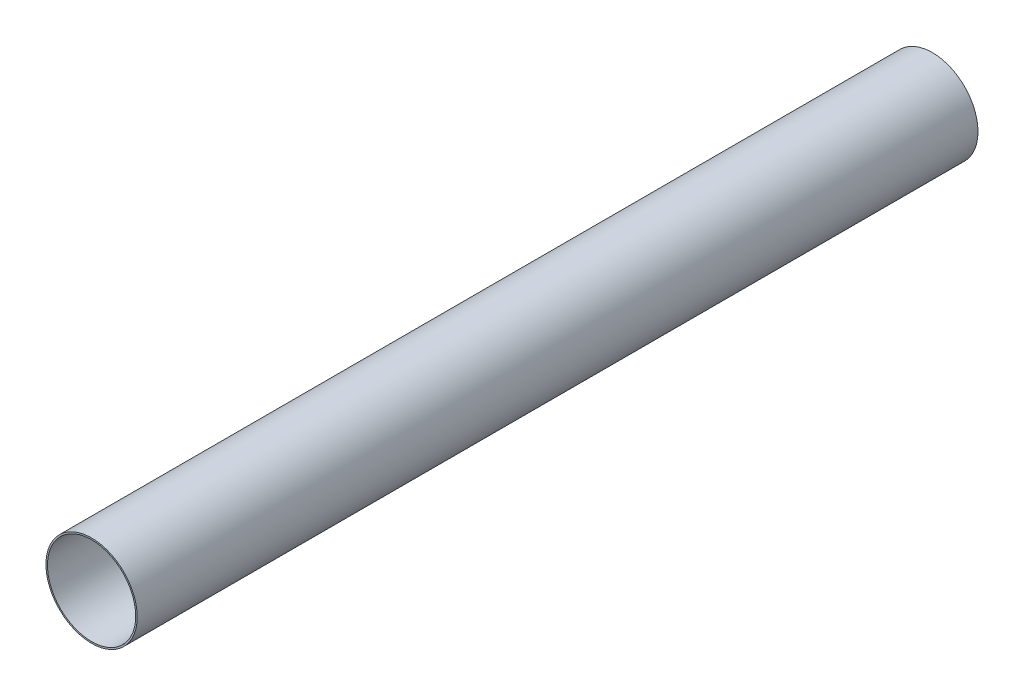
ISO-10303-21;
HEADER;
FILE_DESCRIPTION(('STEP AP214'),'2;1');
FILE_NAME('part.step','',(''),(''),'','','');
FILE_SCHEMA(('AUTOMOTIVE_DESIGN { 1 0 10303 214 1 1 1 1 }'));
ENDSEC;
DATA;
#1=APPLICATION_CONTEXT('core data for automotive mechanical design processes');
#2=APPLICATION_PROTOCOL_DEFINITION('international standard','automotive_design',2000,#1);
#3=PRODUCT_CONTEXT('',#1,'mechanical');
#4=PRODUCT('Part','Part','',(#3));
#5=PRODUCT_RELATED_PRODUCT_CATEGORY('part','',(#4));
#6=PRODUCT_DEFINITION_FORMATION('','',#4);
#7=PRODUCT_DEFINITION_CONTEXT('part definition',#1,'design');
#8=PRODUCT_DEFINITION('design','',#6,#7);
#9=PRODUCT_DEFINITION_SHAPE('','',#8);
#10=(LENGTH_UNIT() NAMED_UNIT(*) SI_UNIT(.MILLI.,.METRE.));
#11=(NAMED_UNIT(*) PLANE_ANGLE_UNIT() SI_UNIT($,.RADIAN.));
#12=(NAMED_UNIT(*) SI_UNIT($,.STERADIAN.) SOLID_ANGLE_UNIT());
#13=UNCERTAINTY_MEASURE_WITH_UNIT(LENGTH_MEASURE(1.E-05),#10,'distance_accuracy_value','');
#14=(GEOMETRIC_REPRESENTATION_CONTEXT(3) GLOBAL_UNCERTAINTY_ASSIGNED_CONTEXT((#13)) GLOBAL_UNIT_ASSIGNED_CONTEXT((#10,
#11,#12)) REPRESENTATION_CONTEXT('',''));
#15=CARTESIAN_POINT('',(0.,0.,0.));
#16=DIRECTION('',(0.,0.,1.));
#17=DIRECTION('',(1.,0.,0.));
#18=AXIS2_PLACEMENT_3D('',#15,#16,#17);
#19=CARTESIAN_POINT('',(0.,0.,279.4));
#20=DIRECTION('',(0.,0.,1.));
#21=DIRECTION('',(1.,0.,0.));
#22=AXIS2_PLACEMENT_3D('',#19,#20,#21);
#23=PLANE('',#22);
#24=CARTESIAN_POINT('',(0.,0.,279.4));
#25=DIRECTION('',(0.,0.,1.));
#26=DIRECTION('',(1.,0.,0.));
#27=AXIS2_PLACEMENT_3D('',#24,#25,#26);
#28=CIRCLE('',#27,15.1765);
#29=CARTESIAN_POINT('',(15.1765,0.,279.4));
#30=VERTEX_POINT('',#29);
#31=EDGE_CURVE('E10',#30,#30,#28,.T.);
#32=ORIENTED_EDGE('',*,*,#31,.T.);
#33=EDGE_LOOP('',(#32));
#34=FACE_BOUND('',#33,.T.);
#35=CARTESIAN_POINT('',(0.,0.,279.4));
#36=DIRECTION('',(0.,0.,1.));
#37=DIRECTION('',(1.,0.,0.));
#38=AXIS2_PLACEMENT_3D('',#35,#36,#37);
#39=CIRCLE('',#38,14.6685);
#40=CARTESIAN_POINT('',(14.6685,0.,279.4));
#41=VERTEX_POINT('',#40);
#42=EDGE_CURVE('E45',#41,#41,#39,.T.);
#43=ORIENTED_EDGE('',*,*,#42,.F.);
#44=EDGE_LOOP('',(#43));
#45=FACE_BOUND('',#44,.T.);
#46=ADVANCED_FACE('F34',(#34,#45),#23,.T.);
#47=CARTESIAN_POINT('',(0.,0.,0.));
#48=DIRECTION('',(0.,0.,1.));
#49=DIRECTION('',(1.,0.,0.));
#50=AXIS2_PLACEMENT_3D('',#47,#48,#49);
#51=PLANE('',#50);
#52=CARTESIAN_POINT('',(0.,0.,0.));
#53=DIRECTION('',(0.,0.,1.));
#54=DIRECTION('',(1.,0.,0.));
#55=AXIS2_PLACEMENT_3D('',#52,#53,#54);
#56=CIRCLE('',#55,15.1765);
#57=CARTESIAN_POINT('',(15.1765,0.,0.));
#58=VERTEX_POINT('',#57);
#59=EDGE_CURVE('E38',#58,#58,#56,.T.);
#60=ORIENTED_EDGE('',*,*,#59,.F.);
#61=EDGE_LOOP('',(#60));
#62=FACE_BOUND('',#61,.T.);
#63=CARTESIAN_POINT('',(0.,0.,0.));
#64=DIRECTION('',(0.,0.,1.));
#65=DIRECTION('',(1.,0.,0.));
#66=AXIS2_PLACEMENT_3D('',#63,#64,#65);
#67=CIRCLE('',#66,14.6685);
#68=CARTESIAN_POINT('',(14.6685,0.,0.));
#69=VERTEX_POINT('',#68);
#70=EDGE_CURVE('E47',#69,#69,#67,.T.);
#71=ORIENTED_EDGE('',*,*,#70,.T.);
#72=EDGE_LOOP('',(#71));
#73=FACE_BOUND('',#72,.T.);
#74=ADVANCED_FACE('F57',(#62,#73),#51,.F.);
#75=CARTESIAN_POINT('',(0.,0.,279.4));
#76=DIRECTION('',(0.,0.,-1.));
#77=DIRECTION('',(-1.,0.,0.));
#78=AXIS2_PLACEMENT_3D('',#75,#76,#77);
#79=CYLINDRICAL_SURFACE('',#78,15.1765);
#80=ORIENTED_EDGE('',*,*,#31,.F.);
#81=EDGE_LOOP('',(#80));
#82=FACE_BOUND('',#81,.T.);
#83=ORIENTED_EDGE('',*,*,#59,.T.);
#84=EDGE_LOOP('',(#83));
#85=FACE_BOUND('',#84,.T.);
#86=ADVANCED_FACE('F36',(#82,#85),#79,.T.);
#87=CARTESIAN_POINT('',(0.,0.,279.4));
#88=DIRECTION('',(0.,0.,-1.));
#89=DIRECTION('',(-1.,0.,0.));
#90=AXIS2_PLACEMENT_3D('',#87,#88,#89);
#91=CYLINDRICAL_SURFACE('',#90,14.6685);
#92=ORIENTED_EDGE('',*,*,#42,.T.);
#93=EDGE_LOOP('',(#92));
#94=FACE_BOUND('',#93,.T.);
#95=ORIENTED_EDGE('',*,*,#70,.F.);
#96=EDGE_LOOP('',(#95));
#97=FACE_BOUND('',#96,.T.);
#98=ADVANCED_FACE('F53',(#94,#97),#91,.F.);
#99=CLOSED_SHELL('',(#46,#74,#86,#98));
#100=MANIFOLD_SOLID_BREP('B2',#99);
#101=ADVANCED_BREP_SHAPE_REPRESENTATION('',(#18,#100),#14);
#102=SHAPE_DEFINITION_REPRESENTATION(#9,#101);
ENDSEC;
END-ISO-10303-21;
